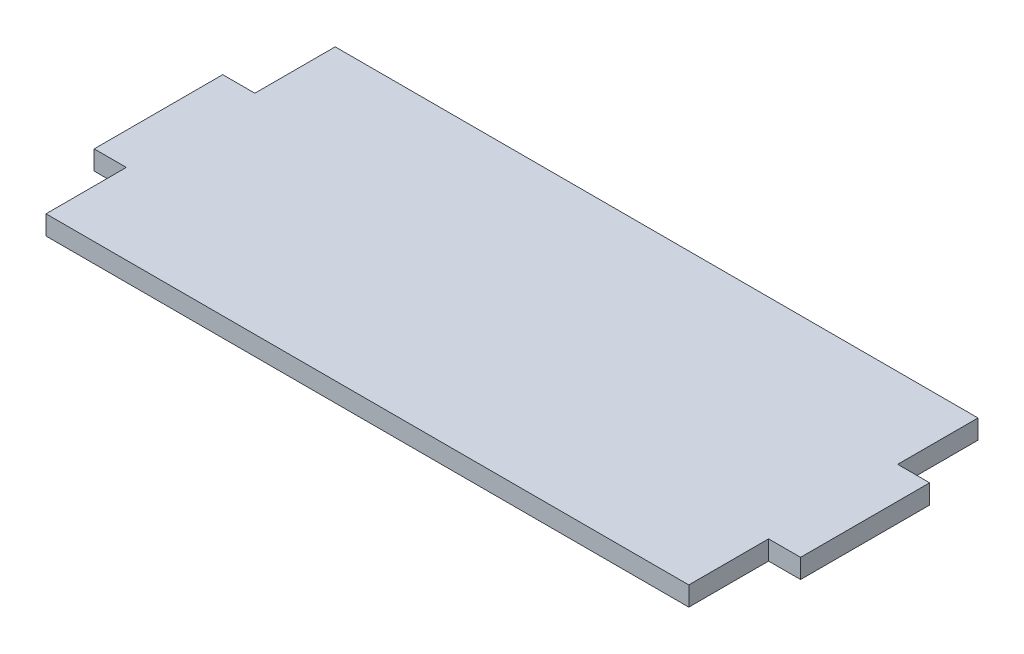
ISO-10303-21;
HEADER;
FILE_DESCRIPTION(('STEP AP214'),'2;1');
FILE_NAME('part.step','',(''),(''),'','','');
FILE_SCHEMA(('AUTOMOTIVE_DESIGN { 1 0 10303 214 1 1 1 1 }'));
ENDSEC;
DATA;
#1=APPLICATION_CONTEXT('core data for automotive mechanical design processes');
#2=APPLICATION_PROTOCOL_DEFINITION('international standard','automotive_design',2000,#1);
#3=PRODUCT_CONTEXT('',#1,'mechanical');
#4=PRODUCT('Part','Part','',(#3));
#5=PRODUCT_RELATED_PRODUCT_CATEGORY('part','',(#4));
#6=PRODUCT_DEFINITION_FORMATION('','',#4);
#7=PRODUCT_DEFINITION_CONTEXT('part definition',#1,'design');
#8=PRODUCT_DEFINITION('design','',#6,#7);
#9=PRODUCT_DEFINITION_SHAPE('','',#8);
#10=(LENGTH_UNIT() NAMED_UNIT(*) SI_UNIT(.MILLI.,.METRE.));
#11=(NAMED_UNIT(*) PLANE_ANGLE_UNIT() SI_UNIT($,.RADIAN.));
#12=(NAMED_UNIT(*) SI_UNIT($,.STERADIAN.) SOLID_ANGLE_UNIT());
#13=UNCERTAINTY_MEASURE_WITH_UNIT(LENGTH_MEASURE(1.E-05),#10,'distance_accuracy_value','');
#14=(GEOMETRIC_REPRESENTATION_CONTEXT(3) GLOBAL_UNCERTAINTY_ASSIGNED_CONTEXT((#13)) GLOBAL_UNIT_ASSIGNED_CONTEXT((#10,
#11,#12)) REPRESENTATION_CONTEXT('',''));
#15=CARTESIAN_POINT('',(0.,0.,0.));
#16=DIRECTION('',(0.,0.,1.));
#17=DIRECTION('',(1.,0.,0.));
#18=AXIS2_PLACEMENT_3D('',#15,#16,#17);
#19=CARTESIAN_POINT('',(0.,0.,0.));
#20=DIRECTION('',(0.,1.,0.));
#21=DIRECTION('',(0.,0.,1.));
#22=AXIS2_PLACEMENT_3D('',#19,#20,#21);
#23=PLANE('',#22);
#24=DIRECTION('',(0.,0.,1.));
#25=VECTOR('',#24,1.);
#26=CARTESIAN_POINT('',(-55.,0.,0.));
#27=LINE('',#26,#25);
#28=CARTESIAN_POINT('',(-55.,0.,-10.));
#29=VERTEX_POINT('',#28);
#30=CARTESIAN_POINT('',(-55.,0.,10.));
#31=VERTEX_POINT('',#30);
#32=EDGE_CURVE('E558',#29,#31,#27,.T.);
#33=ORIENTED_EDGE('',*,*,#32,.F.);
#34=DIRECTION('',(1.,0.,0.));
#35=VECTOR('',#34,1.);
#36=CARTESIAN_POINT('',(0.,0.,-10.));
#37=LINE('',#36,#35);
#38=CARTESIAN_POINT('',(-50.,0.,-10.));
#39=VERTEX_POINT('',#38);
#40=EDGE_CURVE('E613',#29,#39,#37,.T.);
#41=ORIENTED_EDGE('',*,*,#40,.T.);
#42=DIRECTION('',(0.,0.,1.));
#43=VECTOR('',#42,1.);
#44=CARTESIAN_POINT('',(-50.,0.,0.));
#45=LINE('',#44,#43);
#46=CARTESIAN_POINT('',(-50.,0.,-22.5));
#47=VERTEX_POINT('',#46);
#48=EDGE_CURVE('E578',#47,#39,#45,.T.);
#49=ORIENTED_EDGE('',*,*,#48,.F.);
#50=DIRECTION('',(1.,0.,0.));
#51=VECTOR('',#50,1.);
#52=CARTESIAN_POINT('',(0.,0.,-22.5));
#53=LINE('',#52,#51);
#54=CARTESIAN_POINT('',(50.023288524251,0.,-22.5));
#55=VERTEX_POINT('',#54);
#56=EDGE_CURVE('E575',#47,#55,#53,.T.);
#57=ORIENTED_EDGE('',*,*,#56,.T.);
#58=DIRECTION('',(0.,0.,1.));
#59=VECTOR('',#58,1.);
#60=CARTESIAN_POINT('',(50.023288524251,0.,0.));
#61=LINE('',#60,#59);
#62=CARTESIAN_POINT('',(50.023288524251,0.,-10.));
#63=VERTEX_POINT('',#62);
#64=EDGE_CURVE('E540',#55,#63,#61,.T.);
#65=ORIENTED_EDGE('',*,*,#64,.T.);
#66=DIRECTION('',(1.,0.,0.));
#67=VECTOR('',#66,1.);
#68=CARTESIAN_POINT('',(0.,0.,-9.99999999999998));
#69=LINE('',#68,#67);
#70=CARTESIAN_POINT('',(55.,0.,-10.));
#71=VERTEX_POINT('',#70);
#72=EDGE_CURVE('E523',#63,#71,#69,.T.);
#73=ORIENTED_EDGE('',*,*,#72,.T.);
#74=DIRECTION('',(0.,0.,1.));
#75=VECTOR('',#74,1.);
#76=CARTESIAN_POINT('',(55.,0.,0.));
#77=LINE('',#76,#75);
#78=CARTESIAN_POINT('',(55.,0.,10.0853404282764));
#79=VERTEX_POINT('',#78);
#80=EDGE_CURVE('E530',#71,#79,#77,.T.);
#81=ORIENTED_EDGE('',*,*,#80,.T.);
#82=DIRECTION('',(1.,0.,0.));
#83=VECTOR('',#82,1.);
#84=CARTESIAN_POINT('',(0.,0.,10.0853404282764));
#85=LINE('',#84,#83);
#86=CARTESIAN_POINT('',(50.023288524251,0.,10.0853404282764));
#87=VERTEX_POINT('',#86);
#88=EDGE_CURVE('E535',#87,#79,#85,.T.);
#89=ORIENTED_EDGE('',*,*,#88,.F.);
#90=CARTESIAN_POINT('',(50.023288524251,0.,22.5));
#91=VERTEX_POINT('',#90);
#92=EDGE_CURVE('E579',#87,#91,#61,.T.);
#93=ORIENTED_EDGE('',*,*,#92,.T.);
#94=DIRECTION('',(1.,0.,0.));
#95=VECTOR('',#94,1.);
#96=CARTESIAN_POINT('',(0.,0.,22.5));
#97=LINE('',#96,#95);
#98=CARTESIAN_POINT('',(-50.,0.,22.5));
#99=VERTEX_POINT('',#98);
#100=EDGE_CURVE('E583',#99,#91,#97,.T.);
#101=ORIENTED_EDGE('',*,*,#100,.F.);
#102=CARTESIAN_POINT('',(-50.,0.,10.));
#103=VERTEX_POINT('',#102);
#104=EDGE_CURVE('E587',#103,#99,#45,.T.);
#105=ORIENTED_EDGE('',*,*,#104,.F.);
#106=DIRECTION('',(1.,0.,0.));
#107=VECTOR('',#106,1.);
#108=CARTESIAN_POINT('',(0.,0.,10.));
#109=LINE('',#108,#107);
#110=EDGE_CURVE('E618',#31,#103,#109,.T.);
#111=ORIENTED_EDGE('',*,*,#110,.F.);
#112=EDGE_LOOP('',(#33,#41,#49,#57,#65,#73,#81,#89,#93,#101,#105,#111));
#113=FACE_BOUND('',#112,.T.);
#114=ADVANCED_FACE('F429',(#113),#23,.F.);
#115=CARTESIAN_POINT('',(0.,3.,10.));
#116=DIRECTION('',(0.,0.,-1.));
#117=DIRECTION('',(-1.,0.,0.));
#118=AXIS2_PLACEMENT_3D('',#115,#116,#117);
#119=PLANE('',#118);
#120=ORIENTED_EDGE('',*,*,#110,.T.);
#121=DIRECTION('',(0.,-1.,0.));
#122=VECTOR('',#121,1.);
#123=CARTESIAN_POINT('',(-50.,3.,10.));
#124=LINE('',#123,#122);
#125=CARTESIAN_POINT('',(-50.,3.,10.));
#126=VERTEX_POINT('',#125);
#127=EDGE_CURVE('E440',#126,#103,#124,.T.);
#128=ORIENTED_EDGE('',*,*,#127,.F.);
#129=DIRECTION('',(1.,0.,0.));
#130=VECTOR('',#129,1.);
#131=CARTESIAN_POINT('',(0.,3.,10.));
#132=LINE('',#131,#130);
#133=CARTESIAN_POINT('',(-55.,3.,10.));
#134=VERTEX_POINT('',#133);
#135=EDGE_CURVE('E627',#134,#126,#132,.T.);
#136=ORIENTED_EDGE('',*,*,#135,.F.);
#137=DIRECTION('',(0.,-1.,0.));
#138=VECTOR('',#137,1.);
#139=CARTESIAN_POINT('',(-55.,3.,10.));
#140=LINE('',#139,#138);
#141=EDGE_CURVE('E12',#134,#31,#140,.T.);
#142=ORIENTED_EDGE('',*,*,#141,.T.);
#143=EDGE_LOOP('',(#120,#128,#136,#142));
#144=FACE_BOUND('',#143,.T.);
#145=ADVANCED_FACE('F643',(#144),#119,.F.);
#146=CARTESIAN_POINT('',(0.,3.,-10.));
#147=DIRECTION('',(0.,0.,-1.));
#148=DIRECTION('',(-1.,0.,0.));
#149=AXIS2_PLACEMENT_3D('',#146,#147,#148);
#150=PLANE('',#149);
#151=ORIENTED_EDGE('',*,*,#40,.F.);
#152=DIRECTION('',(0.,-1.,0.));
#153=VECTOR('',#152,1.);
#154=CARTESIAN_POINT('',(-55.,3.,-10.));
#155=LINE('',#154,#153);
#156=CARTESIAN_POINT('',(-55.,3.,-10.));
#157=VERTEX_POINT('',#156);
#158=EDGE_CURVE('E449',#157,#29,#155,.T.);
#159=ORIENTED_EDGE('',*,*,#158,.F.);
#160=DIRECTION('',(1.,0.,0.));
#161=VECTOR('',#160,1.);
#162=CARTESIAN_POINT('',(0.,3.,-10.));
#163=LINE('',#162,#161);
#164=CARTESIAN_POINT('',(-50.,3.,-10.));
#165=VERTEX_POINT('',#164);
#166=EDGE_CURVE('E612',#157,#165,#163,.T.);
#167=ORIENTED_EDGE('',*,*,#166,.T.);
#168=DIRECTION('',(0.,-1.,0.));
#169=VECTOR('',#168,1.);
#170=CARTESIAN_POINT('',(-50.,3.,-10.));
#171=LINE('',#170,#169);
#172=EDGE_CURVE('E607',#165,#39,#171,.T.);
#173=ORIENTED_EDGE('',*,*,#172,.T.);
#174=EDGE_LOOP('',(#151,#159,#167,#173));
#175=FACE_BOUND('',#174,.T.);
#176=ADVANCED_FACE('F677',(#175),#150,.T.);
#177=CARTESIAN_POINT('',(-55.,3.,0.));
#178=DIRECTION('',(1.,0.,0.));
#179=DIRECTION('',(0.,0.,-1.));
#180=AXIS2_PLACEMENT_3D('',#177,#178,#179);
#181=PLANE('',#180);
#182=ORIENTED_EDGE('',*,*,#32,.T.);
#183=ORIENTED_EDGE('',*,*,#141,.F.);
#184=DIRECTION('',(0.,0.,1.));
#185=VECTOR('',#184,1.);
#186=CARTESIAN_POINT('',(-55.,3.,0.));
#187=LINE('',#186,#185);
#188=EDGE_CURVE('E617',#157,#134,#187,.T.);
#189=ORIENTED_EDGE('',*,*,#188,.F.);
#190=ORIENTED_EDGE('',*,*,#158,.T.);
#191=EDGE_LOOP('',(#182,#183,#189,#190));
#192=FACE_BOUND('',#191,.T.);
#193=ADVANCED_FACE('F641',(#192),#181,.F.);
#194=CARTESIAN_POINT('',(0.,3.,0.));
#195=DIRECTION('',(0.,1.,0.));
#196=DIRECTION('',(0.,0.,1.));
#197=AXIS2_PLACEMENT_3D('',#194,#195,#196);
#198=PLANE('',#197);
#199=ORIENTED_EDGE('',*,*,#188,.T.);
#200=ORIENTED_EDGE('',*,*,#135,.T.);
#201=DIRECTION('',(0.,0.,1.));
#202=VECTOR('',#201,1.);
#203=CARTESIAN_POINT('',(-50.,3.,0.));
#204=LINE('',#203,#202);
#205=CARTESIAN_POINT('',(-50.,3.,22.5));
#206=VERTEX_POINT('',#205);
#207=EDGE_CURVE('E602',#126,#206,#204,.T.);
#208=ORIENTED_EDGE('',*,*,#207,.T.);
#209=DIRECTION('',(1.,0.,0.));
#210=VECTOR('',#209,1.);
#211=CARTESIAN_POINT('',(0.,3.,22.5));
#212=LINE('',#211,#210);
#213=CARTESIAN_POINT('',(50.023288524251,3.,22.5));
#214=VERTEX_POINT('',#213);
#215=EDGE_CURVE('E599',#206,#214,#212,.T.);
#216=ORIENTED_EDGE('',*,*,#215,.T.);
#217=DIRECTION('',(0.,0.,1.));
#218=VECTOR('',#217,1.);
#219=CARTESIAN_POINT('',(50.023288524251,3.,0.));
#220=LINE('',#219,#218);
#221=CARTESIAN_POINT('',(50.023288524251,3.,10.0853404282764));
#222=VERTEX_POINT('',#221);
#223=EDGE_CURVE('E595',#222,#214,#220,.T.);
#224=ORIENTED_EDGE('',*,*,#223,.F.);
#225=DIRECTION('',(1.,0.,0.));
#226=VECTOR('',#225,1.);
#227=CARTESIAN_POINT('',(0.,3.,10.0853404282764));
#228=LINE('',#227,#226);
#229=CARTESIAN_POINT('',(55.,3.,10.0853404282764));
#230=VERTEX_POINT('',#229);
#231=EDGE_CURVE('E542',#222,#230,#228,.T.);
#232=ORIENTED_EDGE('',*,*,#231,.T.);
#233=DIRECTION('',(0.,0.,1.));
#234=VECTOR('',#233,1.);
#235=CARTESIAN_POINT('',(55.,3.,0.));
#236=LINE('',#235,#234);
#237=CARTESIAN_POINT('',(55.,3.,-10.));
#238=VERTEX_POINT('',#237);
#239=EDGE_CURVE('E545',#238,#230,#236,.T.);
#240=ORIENTED_EDGE('',*,*,#239,.F.);
#241=DIRECTION('',(1.,0.,0.));
#242=VECTOR('',#241,1.);
#243=CARTESIAN_POINT('',(0.,3.,-9.99999999999998));
#244=LINE('',#243,#242);
#245=CARTESIAN_POINT('',(50.023288524251,3.,-10.));
#246=VERTEX_POINT('',#245);
#247=EDGE_CURVE('E526',#246,#238,#244,.T.);
#248=ORIENTED_EDGE('',*,*,#247,.F.);
#249=CARTESIAN_POINT('',(50.023288524251,3.,-22.5));
#250=VERTEX_POINT('',#249);
#251=EDGE_CURVE('E594',#250,#246,#220,.T.);
#252=ORIENTED_EDGE('',*,*,#251,.F.);
#253=DIRECTION('',(1.,0.,0.));
#254=VECTOR('',#253,1.);
#255=CARTESIAN_POINT('',(0.,3.,-22.5));
#256=LINE('',#255,#254);
#257=CARTESIAN_POINT('',(-50.,3.,-22.5));
#258=VERTEX_POINT('',#257);
#259=EDGE_CURVE('E590',#258,#250,#256,.T.);
#260=ORIENTED_EDGE('',*,*,#259,.F.);
#261=EDGE_CURVE('E574',#258,#165,#204,.T.);
#262=ORIENTED_EDGE('',*,*,#261,.T.);
#263=ORIENTED_EDGE('',*,*,#166,.F.);
#264=EDGE_LOOP('',(#199,#200,#208,#216,#224,#232,#240,#248,#252,#260,#262,#263));
#265=FACE_BOUND('',#264,.T.);
#266=ADVANCED_FACE('F636',(#265),#198,.T.);
#267=CARTESIAN_POINT('',(55.,3.,0.));
#268=DIRECTION('',(1.,0.,0.));
#269=DIRECTION('',(0.,0.,-1.));
#270=AXIS2_PLACEMENT_3D('',#267,#268,#269);
#271=PLANE('',#270);
#272=ORIENTED_EDGE('',*,*,#80,.F.);
#273=DIRECTION('',(0.,-1.,0.));
#274=VECTOR('',#273,1.);
#275=CARTESIAN_POINT('',(55.,3.,-10.));
#276=LINE('',#275,#274);
#277=EDGE_CURVE('E520',#238,#71,#276,.T.);
#278=ORIENTED_EDGE('',*,*,#277,.F.);
#279=ORIENTED_EDGE('',*,*,#239,.T.);
#280=DIRECTION('',(0.,-1.,0.));
#281=VECTOR('',#280,1.);
#282=CARTESIAN_POINT('',(55.,3.,10.0853404282764));
#283=LINE('',#282,#281);
#284=EDGE_CURVE('E433',#230,#79,#283,.T.);
#285=ORIENTED_EDGE('',*,*,#284,.T.);
#286=EDGE_LOOP('',(#272,#278,#279,#285));
#287=FACE_BOUND('',#286,.T.);
#288=ADVANCED_FACE('F531',(#287),#271,.T.);
#289=CARTESIAN_POINT('',(0.,3.,10.0853404282764));
#290=DIRECTION('',(0.,0.,-1.));
#291=DIRECTION('',(-1.,0.,0.));
#292=AXIS2_PLACEMENT_3D('',#289,#290,#291);
#293=PLANE('',#292);
#294=ORIENTED_EDGE('',*,*,#88,.T.);
#295=ORIENTED_EDGE('',*,*,#284,.F.);
#296=ORIENTED_EDGE('',*,*,#231,.F.);
#297=DIRECTION('',(0.,-1.,0.));
#298=VECTOR('',#297,1.);
#299=CARTESIAN_POINT('',(50.023288524251,3.,10.0853404282764));
#300=LINE('',#299,#298);
#301=EDGE_CURVE('E562',#222,#87,#300,.T.);
#302=ORIENTED_EDGE('',*,*,#301,.T.);
#303=EDGE_LOOP('',(#294,#295,#296,#302));
#304=FACE_BOUND('',#303,.T.);
#305=ADVANCED_FACE('F431',(#304),#293,.F.);
#306=CARTESIAN_POINT('',(0.,3.,-9.99999999999998));
#307=DIRECTION('',(0.,0.,-1.));
#308=DIRECTION('',(-1.,0.,0.));
#309=AXIS2_PLACEMENT_3D('',#306,#307,#308);
#310=PLANE('',#309);
#311=ORIENTED_EDGE('',*,*,#72,.F.);
#312=DIRECTION('',(0.,-1.,0.));
#313=VECTOR('',#312,1.);
#314=CARTESIAN_POINT('',(50.023288524251,3.,-10.));
#315=LINE('',#314,#313);
#316=EDGE_CURVE('E565',#246,#63,#315,.T.);
#317=ORIENTED_EDGE('',*,*,#316,.F.);
#318=ORIENTED_EDGE('',*,*,#247,.T.);
#319=ORIENTED_EDGE('',*,*,#277,.T.);
#320=EDGE_LOOP('',(#311,#317,#318,#319));
#321=FACE_BOUND('',#320,.T.);
#322=ADVANCED_FACE('F521',(#321),#310,.T.);
#323=CARTESIAN_POINT('',(50.023288524251,3.,0.));
#324=DIRECTION('',(1.,0.,0.));
#325=DIRECTION('',(0.,0.,-1.));
#326=AXIS2_PLACEMENT_3D('',#323,#324,#325);
#327=PLANE('',#326);
#328=ORIENTED_EDGE('',*,*,#92,.F.);
#329=ORIENTED_EDGE('',*,*,#301,.F.);
#330=ORIENTED_EDGE('',*,*,#223,.T.);
#331=DIRECTION('',(0.,-1.,0.));
#332=VECTOR('',#331,1.);
#333=CARTESIAN_POINT('',(50.023288524251,3.,22.5));
#334=LINE('',#333,#332);
#335=EDGE_CURVE('E559',#214,#91,#334,.T.);
#336=ORIENTED_EDGE('',*,*,#335,.T.);
#337=EDGE_LOOP('',(#328,#329,#330,#336));
#338=FACE_BOUND('',#337,.T.);
#339=ADVANCED_FACE('F658',(#338),#327,.T.);
#340=ORIENTED_EDGE('',*,*,#64,.F.);
#341=DIRECTION('',(0.,-1.,0.));
#342=VECTOR('',#341,1.);
#343=CARTESIAN_POINT('',(50.023288524251,3.,-22.5));
#344=LINE('',#343,#342);
#345=EDGE_CURVE('E568',#250,#55,#344,.T.);
#346=ORIENTED_EDGE('',*,*,#345,.F.);
#347=ORIENTED_EDGE('',*,*,#251,.T.);
#348=ORIENTED_EDGE('',*,*,#316,.T.);
#349=EDGE_LOOP('',(#340,#346,#347,#348));
#350=FACE_BOUND('',#349,.T.);
#351=ADVANCED_FACE('F665',(#350),#327,.T.);
#352=CARTESIAN_POINT('',(0.,3.,22.5));
#353=DIRECTION('',(0.,0.,-1.));
#354=DIRECTION('',(-1.,0.,0.));
#355=AXIS2_PLACEMENT_3D('',#352,#353,#354);
#356=PLANE('',#355);
#357=ORIENTED_EDGE('',*,*,#100,.T.);
#358=ORIENTED_EDGE('',*,*,#335,.F.);
#359=ORIENTED_EDGE('',*,*,#215,.F.);
#360=DIRECTION('',(0.,-1.,0.));
#361=VECTOR('',#360,1.);
#362=CARTESIAN_POINT('',(-50.,3.,22.5));
#363=LINE('',#362,#361);
#364=EDGE_CURVE('E554',#206,#99,#363,.T.);
#365=ORIENTED_EDGE('',*,*,#364,.T.);
#366=EDGE_LOOP('',(#357,#358,#359,#365));
#367=FACE_BOUND('',#366,.T.);
#368=ADVANCED_FACE('F654',(#367),#356,.F.);
#369=CARTESIAN_POINT('',(0.,3.,-22.5));
#370=DIRECTION('',(0.,0.,-1.));
#371=DIRECTION('',(-1.,0.,0.));
#372=AXIS2_PLACEMENT_3D('',#369,#370,#371);
#373=PLANE('',#372);
#374=ORIENTED_EDGE('',*,*,#56,.F.);
#375=DIRECTION('',(0.,-1.,0.));
#376=VECTOR('',#375,1.);
#377=CARTESIAN_POINT('',(-50.,3.,-22.5));
#378=LINE('',#377,#376);
#379=EDGE_CURVE('E571',#258,#47,#378,.T.);
#380=ORIENTED_EDGE('',*,*,#379,.F.);
#381=ORIENTED_EDGE('',*,*,#259,.T.);
#382=ORIENTED_EDGE('',*,*,#345,.T.);
#383=EDGE_LOOP('',(#374,#380,#381,#382));
#384=FACE_BOUND('',#383,.T.);
#385=ADVANCED_FACE('F729',(#384),#373,.T.);
#386=CARTESIAN_POINT('',(-50.,3.,0.));
#387=DIRECTION('',(1.,0.,0.));
#388=DIRECTION('',(0.,0.,-1.));
#389=AXIS2_PLACEMENT_3D('',#386,#387,#388);
#390=PLANE('',#389);
#391=ORIENTED_EDGE('',*,*,#48,.T.);
#392=ORIENTED_EDGE('',*,*,#172,.F.);
#393=ORIENTED_EDGE('',*,*,#261,.F.);
#394=ORIENTED_EDGE('',*,*,#379,.T.);
#395=EDGE_LOOP('',(#391,#392,#393,#394));
#396=FACE_BOUND('',#395,.T.);
#397=ADVANCED_FACE('F674',(#396),#390,.F.);
#398=ORIENTED_EDGE('',*,*,#104,.T.);
#399=ORIENTED_EDGE('',*,*,#364,.F.);
#400=ORIENTED_EDGE('',*,*,#207,.F.);
#401=ORIENTED_EDGE('',*,*,#127,.T.);
#402=EDGE_LOOP('',(#398,#399,#400,#401));
#403=FACE_BOUND('',#402,.T.);
#404=ADVANCED_FACE('F649',(#403),#390,.F.);
#405=CLOSED_SHELL('',(#114,#145,#176,#193,#266,#288,#305,#322,#339,#351,#368,#385,#397,#404));
#406=MANIFOLD_SOLID_BREP('B2',#405);
#407=ADVANCED_BREP_SHAPE_REPRESENTATION('',(#18,#406),#14);
#408=SHAPE_DEFINITION_REPRESENTATION(#9,#407);
ENDSEC;
END-ISO-10303-21;
